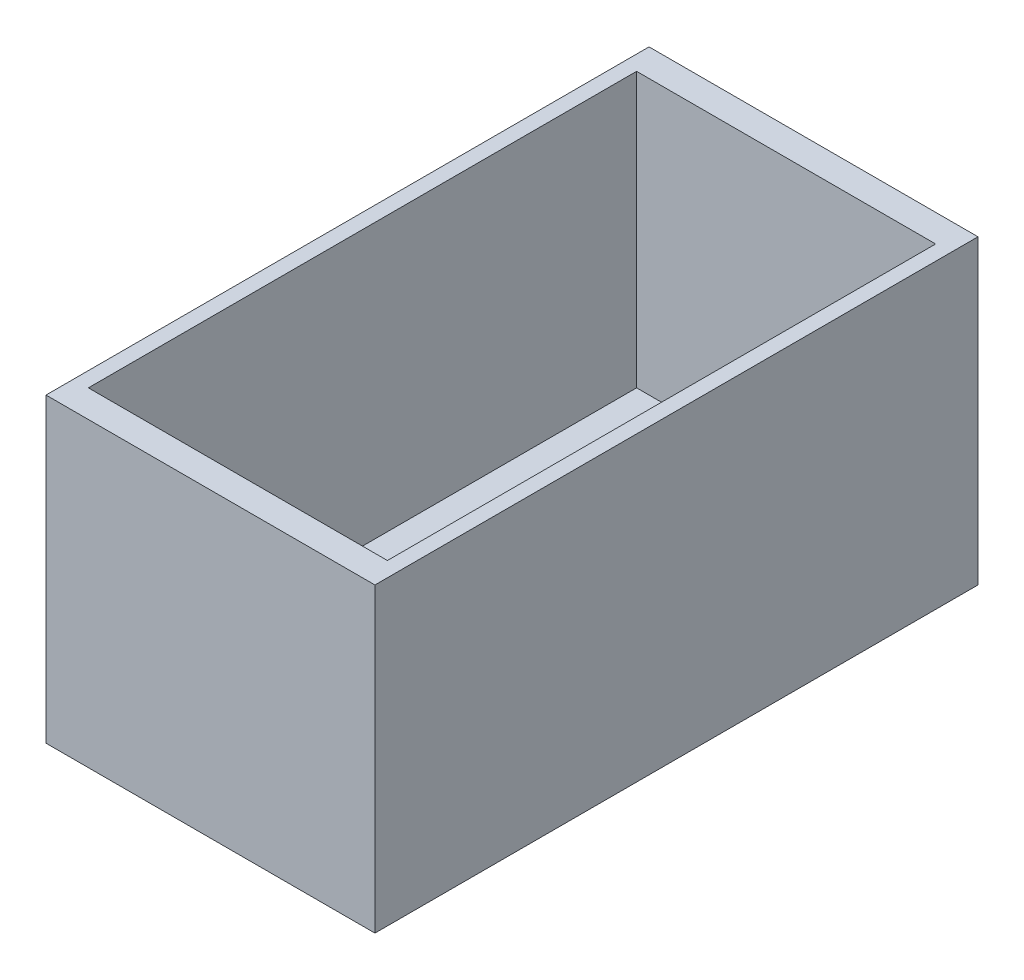
ISO-10303-21;
HEADER;
FILE_DESCRIPTION(('STEP AP214'),'2;1');
FILE_NAME('part.step','',(''),(''),'','','');
FILE_SCHEMA(('AUTOMOTIVE_DESIGN { 1 0 10303 214 1 1 1 1 }'));
ENDSEC;
DATA;
#1=APPLICATION_CONTEXT('core data for automotive mechanical design processes');
#2=APPLICATION_PROTOCOL_DEFINITION('international standard','automotive_design',2000,#1);
#3=PRODUCT_CONTEXT('',#1,'mechanical');
#4=PRODUCT('Part','Part','',(#3));
#5=PRODUCT_RELATED_PRODUCT_CATEGORY('part','',(#4));
#6=PRODUCT_DEFINITION_FORMATION('','',#4);
#7=PRODUCT_DEFINITION_CONTEXT('part definition',#1,'design');
#8=PRODUCT_DEFINITION('design','',#6,#7);
#9=PRODUCT_DEFINITION_SHAPE('','',#8);
#10=(LENGTH_UNIT() NAMED_UNIT(*) SI_UNIT(.MILLI.,.METRE.));
#11=(NAMED_UNIT(*) PLANE_ANGLE_UNIT() SI_UNIT($,.RADIAN.));
#12=(NAMED_UNIT(*) SI_UNIT($,.STERADIAN.) SOLID_ANGLE_UNIT());
#13=UNCERTAINTY_MEASURE_WITH_UNIT(LENGTH_MEASURE(1.E-05),#10,'distance_accuracy_value','');
#14=(GEOMETRIC_REPRESENTATION_CONTEXT(3) GLOBAL_UNCERTAINTY_ASSIGNED_CONTEXT((#13)) GLOBAL_UNIT_ASSIGNED_CONTEXT((#10,
#11,#12)) REPRESENTATION_CONTEXT('',''));
#15=CARTESIAN_POINT('',(0.,0.,0.));
#16=DIRECTION('',(0.,0.,1.));
#17=DIRECTION('',(1.,0.,0.));
#18=AXIS2_PLACEMENT_3D('',#15,#16,#17);
#19=CARTESIAN_POINT('',(30.,5.,-55.));
#20=DIRECTION('',(-1.,0.,0.));
#21=DIRECTION('',(0.,0.,1.));
#22=AXIS2_PLACEMENT_3D('',#19,#20,#21);
#23=PLANE('',#22);
#24=DIRECTION('',(0.,0.,-1.));
#25=VECTOR('',#24,1.);
#26=CARTESIAN_POINT('',(30.,0.,-55.));
#27=LINE('',#26,#25);
#28=CARTESIAN_POINT('',(30.,0.,55.));
#29=VERTEX_POINT('',#28);
#30=CARTESIAN_POINT('',(30.,0.,-55.));
#31=VERTEX_POINT('',#30);
#32=EDGE_CURVE('E144',#29,#31,#27,.T.);
#33=ORIENTED_EDGE('',*,*,#32,.T.);
#34=DIRECTION('',(0.,-1.,0.));
#35=VECTOR('',#34,1.);
#36=CARTESIAN_POINT('',(30.,5.,-55.));
#37=LINE('',#36,#35);
#38=CARTESIAN_POINT('',(30.,55.,-55.));
#39=VERTEX_POINT('',#38);
#40=EDGE_CURVE('E11',#39,#31,#37,.T.);
#41=ORIENTED_EDGE('',*,*,#40,.F.);
#42=DIRECTION('',(0.,0.,-1.));
#43=VECTOR('',#42,1.);
#44=CARTESIAN_POINT('',(30.,55.,-55.));
#45=LINE('',#44,#43);
#46=CARTESIAN_POINT('',(30.,55.,55.));
#47=VERTEX_POINT('',#46);
#48=EDGE_CURVE('E111',#47,#39,#45,.T.);
#49=ORIENTED_EDGE('',*,*,#48,.F.);
#50=DIRECTION('',(0.,-1.,0.));
#51=VECTOR('',#50,1.);
#52=CARTESIAN_POINT('',(30.,5.,55.));
#53=LINE('',#52,#51);
#54=EDGE_CURVE('E153',#47,#29,#53,.T.);
#55=ORIENTED_EDGE('',*,*,#54,.T.);
#56=EDGE_LOOP('',(#33,#41,#49,#55));
#57=FACE_BOUND('',#56,.T.);
#58=ADVANCED_FACE('F33',(#57),#23,.F.);
#59=CARTESIAN_POINT('',(-30.,5.,-55.));
#60=DIRECTION('',(0.,0.,1.));
#61=DIRECTION('',(1.,0.,0.));
#62=AXIS2_PLACEMENT_3D('',#59,#60,#61);
#63=PLANE('',#62);
#64=DIRECTION('',(-1.,0.,0.));
#65=VECTOR('',#64,1.);
#66=CARTESIAN_POINT('',(-30.,0.,-55.));
#67=LINE('',#66,#65);
#68=CARTESIAN_POINT('',(-30.,0.,-55.));
#69=VERTEX_POINT('',#68);
#70=EDGE_CURVE('E147',#31,#69,#67,.T.);
#71=ORIENTED_EDGE('',*,*,#70,.T.);
#72=DIRECTION('',(0.,-1.,0.));
#73=VECTOR('',#72,1.);
#74=CARTESIAN_POINT('',(-30.,5.,-55.));
#75=LINE('',#74,#73);
#76=CARTESIAN_POINT('',(-30.,55.,-55.));
#77=VERTEX_POINT('',#76);
#78=EDGE_CURVE('E40',#77,#69,#75,.T.);
#79=ORIENTED_EDGE('',*,*,#78,.F.);
#80=DIRECTION('',(-1.,0.,0.));
#81=VECTOR('',#80,1.);
#82=CARTESIAN_POINT('',(-30.,55.,-55.));
#83=LINE('',#82,#81);
#84=EDGE_CURVE('E135',#39,#77,#83,.T.);
#85=ORIENTED_EDGE('',*,*,#84,.F.);
#86=ORIENTED_EDGE('',*,*,#40,.T.);
#87=EDGE_LOOP('',(#71,#79,#85,#86));
#88=FACE_BOUND('',#87,.T.);
#89=ADVANCED_FACE('F175',(#88),#63,.F.);
#90=CARTESIAN_POINT('',(-30.,5.,-55.));
#91=DIRECTION('',(1.,0.,0.));
#92=DIRECTION('',(0.,0.,-1.));
#93=AXIS2_PLACEMENT_3D('',#90,#91,#92);
#94=PLANE('',#93);
#95=DIRECTION('',(0.,0.,1.));
#96=VECTOR('',#95,1.);
#97=CARTESIAN_POINT('',(-30.,0.,-55.));
#98=LINE('',#97,#96);
#99=CARTESIAN_POINT('',(-30.,0.,55.));
#100=VERTEX_POINT('',#99);
#101=EDGE_CURVE('E149',#69,#100,#98,.T.);
#102=ORIENTED_EDGE('',*,*,#101,.T.);
#103=DIRECTION('',(0.,-1.,0.));
#104=VECTOR('',#103,1.);
#105=CARTESIAN_POINT('',(-30.,5.,55.));
#106=LINE('',#105,#104);
#107=CARTESIAN_POINT('',(-30.,55.,55.));
#108=VERTEX_POINT('',#107);
#109=EDGE_CURVE('E156',#108,#100,#106,.T.);
#110=ORIENTED_EDGE('',*,*,#109,.F.);
#111=DIRECTION('',(0.,0.,1.));
#112=VECTOR('',#111,1.);
#113=CARTESIAN_POINT('',(-30.,55.,-55.));
#114=LINE('',#113,#112);
#115=EDGE_CURVE('E138',#77,#108,#114,.T.);
#116=ORIENTED_EDGE('',*,*,#115,.F.);
#117=ORIENTED_EDGE('',*,*,#78,.T.);
#118=EDGE_LOOP('',(#102,#110,#116,#117));
#119=FACE_BOUND('',#118,.T.);
#120=ADVANCED_FACE('F162',(#119),#94,.F.);
#121=CARTESIAN_POINT('',(-30.,5.,55.));
#122=DIRECTION('',(0.,0.,-1.));
#123=DIRECTION('',(-1.,0.,0.));
#124=AXIS2_PLACEMENT_3D('',#121,#122,#123);
#125=PLANE('',#124);
#126=DIRECTION('',(1.,0.,0.));
#127=VECTOR('',#126,1.);
#128=CARTESIAN_POINT('',(-30.,0.,55.));
#129=LINE('',#128,#127);
#130=EDGE_CURVE('E151',#100,#29,#129,.T.);
#131=ORIENTED_EDGE('',*,*,#130,.T.);
#132=ORIENTED_EDGE('',*,*,#54,.F.);
#133=DIRECTION('',(1.,0.,0.));
#134=VECTOR('',#133,1.);
#135=CARTESIAN_POINT('',(-30.,55.,55.));
#136=LINE('',#135,#134);
#137=EDGE_CURVE('E141',#108,#47,#136,.T.);
#138=ORIENTED_EDGE('',*,*,#137,.F.);
#139=ORIENTED_EDGE('',*,*,#109,.T.);
#140=EDGE_LOOP('',(#131,#132,#138,#139));
#141=FACE_BOUND('',#140,.T.);
#142=ADVANCED_FACE('F170',(#141),#125,.F.);
#143=CARTESIAN_POINT('',(0.,0.,0.));
#144=DIRECTION('',(0.,1.,0.));
#145=DIRECTION('',(0.,0.,1.));
#146=AXIS2_PLACEMENT_3D('',#143,#144,#145);
#147=PLANE('',#146);
#148=ORIENTED_EDGE('',*,*,#32,.F.);
#149=ORIENTED_EDGE('',*,*,#130,.F.);
#150=ORIENTED_EDGE('',*,*,#101,.F.);
#151=ORIENTED_EDGE('',*,*,#70,.F.);
#152=EDGE_LOOP('',(#148,#149,#150,#151));
#153=FACE_BOUND('',#152,.T.);
#154=ADVANCED_FACE('F168',(#153),#147,.F.);
#155=CARTESIAN_POINT('',(0.,55.,0.));
#156=DIRECTION('',(0.,1.,0.));
#157=DIRECTION('',(0.,0.,1.));
#158=AXIS2_PLACEMENT_3D('',#155,#156,#157);
#159=PLANE('',#158);
#160=ORIENTED_EDGE('',*,*,#48,.T.);
#161=ORIENTED_EDGE('',*,*,#84,.T.);
#162=ORIENTED_EDGE('',*,*,#115,.T.);
#163=ORIENTED_EDGE('',*,*,#137,.T.);
#164=EDGE_LOOP('',(#160,#161,#162,#163));
#165=FACE_BOUND('',#164,.T.);
#166=DIRECTION('',(-1.,0.,0.));
#167=VECTOR('',#166,1.);
#168=CARTESIAN_POINT('',(-27.2727272727273,55.,-50.));
#169=LINE('',#168,#167);
#170=CARTESIAN_POINT('',(27.2727272727273,55.,-50.));
#171=VERTEX_POINT('',#170);
#172=CARTESIAN_POINT('',(-27.2727272727273,55.,-50.));
#173=VERTEX_POINT('',#172);
#174=EDGE_CURVE('E105',#171,#173,#169,.T.);
#175=ORIENTED_EDGE('',*,*,#174,.F.);
#176=DIRECTION('',(0.,0.,-1.));
#177=VECTOR('',#176,1.);
#178=CARTESIAN_POINT('',(27.2727272727273,55.,-50.));
#179=LINE('',#178,#177);
#180=CARTESIAN_POINT('',(27.2727272727273,55.,50.));
#181=VERTEX_POINT('',#180);
#182=EDGE_CURVE('E96',#181,#171,#179,.T.);
#183=ORIENTED_EDGE('',*,*,#182,.F.);
#184=DIRECTION('',(1.,0.,0.));
#185=VECTOR('',#184,1.);
#186=CARTESIAN_POINT('',(-27.2727272727273,55.,50.));
#187=LINE('',#186,#185);
#188=CARTESIAN_POINT('',(-27.2727272727273,55.,50.));
#189=VERTEX_POINT('',#188);
#190=EDGE_CURVE('E119',#189,#181,#187,.T.);
#191=ORIENTED_EDGE('',*,*,#190,.F.);
#192=DIRECTION('',(0.,0.,1.));
#193=VECTOR('',#192,1.);
#194=CARTESIAN_POINT('',(-27.2727272727273,55.,-50.));
#195=LINE('',#194,#193);
#196=EDGE_CURVE('E117',#173,#189,#195,.T.);
#197=ORIENTED_EDGE('',*,*,#196,.F.);
#198=EDGE_LOOP('',(#175,#183,#191,#197));
#199=FACE_BOUND('',#198,.T.);
#200=ADVANCED_FACE('F115',(#165,#199),#159,.T.);
#201=CARTESIAN_POINT('',(27.2727272727273,55.,-50.));
#202=DIRECTION('',(-1.,0.,0.));
#203=DIRECTION('',(0.,0.,1.));
#204=AXIS2_PLACEMENT_3D('',#201,#202,#203);
#205=PLANE('',#204);
#206=DIRECTION('',(0.,0.,-1.));
#207=VECTOR('',#206,1.);
#208=CARTESIAN_POINT('',(27.2727272727273,5.,-50.));
#209=LINE('',#208,#207);
#210=CARTESIAN_POINT('',(27.2727272727273,5.,50.));
#211=VERTEX_POINT('',#210);
#212=CARTESIAN_POINT('',(27.2727272727273,5.,-50.));
#213=VERTEX_POINT('',#212);
#214=EDGE_CURVE('E47',#211,#213,#209,.T.);
#215=ORIENTED_EDGE('',*,*,#214,.F.);
#216=DIRECTION('',(0.,-1.,0.));
#217=VECTOR('',#216,1.);
#218=CARTESIAN_POINT('',(27.2727272727273,55.,50.));
#219=LINE('',#218,#217);
#220=EDGE_CURVE('E101',#181,#211,#219,.T.);
#221=ORIENTED_EDGE('',*,*,#220,.F.);
#222=ORIENTED_EDGE('',*,*,#182,.T.);
#223=DIRECTION('',(0.,-1.,0.));
#224=VECTOR('',#223,1.);
#225=CARTESIAN_POINT('',(27.2727272727273,55.,-50.));
#226=LINE('',#225,#224);
#227=EDGE_CURVE('E99',#171,#213,#226,.T.);
#228=ORIENTED_EDGE('',*,*,#227,.T.);
#229=EDGE_LOOP('',(#215,#221,#222,#228));
#230=FACE_BOUND('',#229,.T.);
#231=ADVANCED_FACE('F98',(#230),#205,.T.);
#232=CARTESIAN_POINT('',(-27.2727272727273,55.,-50.));
#233=DIRECTION('',(0.,0.,1.));
#234=DIRECTION('',(1.,0.,0.));
#235=AXIS2_PLACEMENT_3D('',#232,#233,#234);
#236=PLANE('',#235);
#237=DIRECTION('',(-1.,0.,0.));
#238=VECTOR('',#237,1.);
#239=CARTESIAN_POINT('',(-27.2727272727273,5.,-50.));
#240=LINE('',#239,#238);
#241=CARTESIAN_POINT('',(-27.2727272727273,5.,-50.));
#242=VERTEX_POINT('',#241);
#243=EDGE_CURVE('E51',#213,#242,#240,.T.);
#244=ORIENTED_EDGE('',*,*,#243,.F.);
#245=ORIENTED_EDGE('',*,*,#227,.F.);
#246=ORIENTED_EDGE('',*,*,#174,.T.);
#247=DIRECTION('',(0.,-1.,0.));
#248=VECTOR('',#247,1.);
#249=CARTESIAN_POINT('',(-27.2727272727273,55.,-50.));
#250=LINE('',#249,#248);
#251=EDGE_CURVE('E112',#173,#242,#250,.T.);
#252=ORIENTED_EDGE('',*,*,#251,.T.);
#253=EDGE_LOOP('',(#244,#245,#246,#252));
#254=FACE_BOUND('',#253,.T.);
#255=ADVANCED_FACE('F109',(#254),#236,.T.);
#256=CARTESIAN_POINT('',(-27.2727272727273,55.,-50.));
#257=DIRECTION('',(1.,0.,0.));
#258=DIRECTION('',(0.,0.,-1.));
#259=AXIS2_PLACEMENT_3D('',#256,#257,#258);
#260=PLANE('',#259);
#261=DIRECTION('',(0.,0.,1.));
#262=VECTOR('',#261,1.);
#263=CARTESIAN_POINT('',(-27.2727272727273,5.,-50.));
#264=LINE('',#263,#262);
#265=CARTESIAN_POINT('',(-27.2727272727273,5.,50.));
#266=VERTEX_POINT('',#265);
#267=EDGE_CURVE('E125',#242,#266,#264,.T.);
#268=ORIENTED_EDGE('',*,*,#267,.F.);
#269=ORIENTED_EDGE('',*,*,#251,.F.);
#270=ORIENTED_EDGE('',*,*,#196,.T.);
#271=DIRECTION('',(0.,-1.,0.));
#272=VECTOR('',#271,1.);
#273=CARTESIAN_POINT('',(-27.2727272727273,55.,50.));
#274=LINE('',#273,#272);
#275=EDGE_CURVE('E129',#189,#266,#274,.T.);
#276=ORIENTED_EDGE('',*,*,#275,.T.);
#277=EDGE_LOOP('',(#268,#269,#270,#276));
#278=FACE_BOUND('',#277,.T.);
#279=ADVANCED_FACE('F197',(#278),#260,.T.);
#280=CARTESIAN_POINT('',(-27.2727272727273,55.,50.));
#281=DIRECTION('',(0.,0.,-1.));
#282=DIRECTION('',(-1.,0.,0.));
#283=AXIS2_PLACEMENT_3D('',#280,#281,#282);
#284=PLANE('',#283);
#285=DIRECTION('',(1.,0.,0.));
#286=VECTOR('',#285,1.);
#287=CARTESIAN_POINT('',(-27.2727272727273,5.,50.));
#288=LINE('',#287,#286);
#289=EDGE_CURVE('E106',#266,#211,#288,.T.);
#290=ORIENTED_EDGE('',*,*,#289,.F.);
#291=ORIENTED_EDGE('',*,*,#275,.F.);
#292=ORIENTED_EDGE('',*,*,#190,.T.);
#293=ORIENTED_EDGE('',*,*,#220,.T.);
#294=EDGE_LOOP('',(#290,#291,#292,#293));
#295=FACE_BOUND('',#294,.T.);
#296=ADVANCED_FACE('F190',(#295),#284,.T.);
#297=CARTESIAN_POINT('',(0.,5.,0.));
#298=DIRECTION('',(0.,1.,0.));
#299=DIRECTION('',(0.,0.,1.));
#300=AXIS2_PLACEMENT_3D('',#297,#298,#299);
#301=PLANE('',#300);
#302=ORIENTED_EDGE('',*,*,#214,.T.);
#303=ORIENTED_EDGE('',*,*,#243,.T.);
#304=ORIENTED_EDGE('',*,*,#267,.T.);
#305=ORIENTED_EDGE('',*,*,#289,.T.);
#306=EDGE_LOOP('',(#302,#303,#304,#305));
#307=FACE_BOUND('',#306,.T.);
#308=ADVANCED_FACE('F187',(#307),#301,.T.);
#309=CLOSED_SHELL('',(#58,#89,#120,#142,#154,#200,#231,#255,#279,#296,#308));
#310=MANIFOLD_SOLID_BREP('B2',#309);
#311=ADVANCED_BREP_SHAPE_REPRESENTATION('',(#18,#310),#14);
#312=SHAPE_DEFINITION_REPRESENTATION(#9,#311);
ENDSEC;
END-ISO-10303-21;
